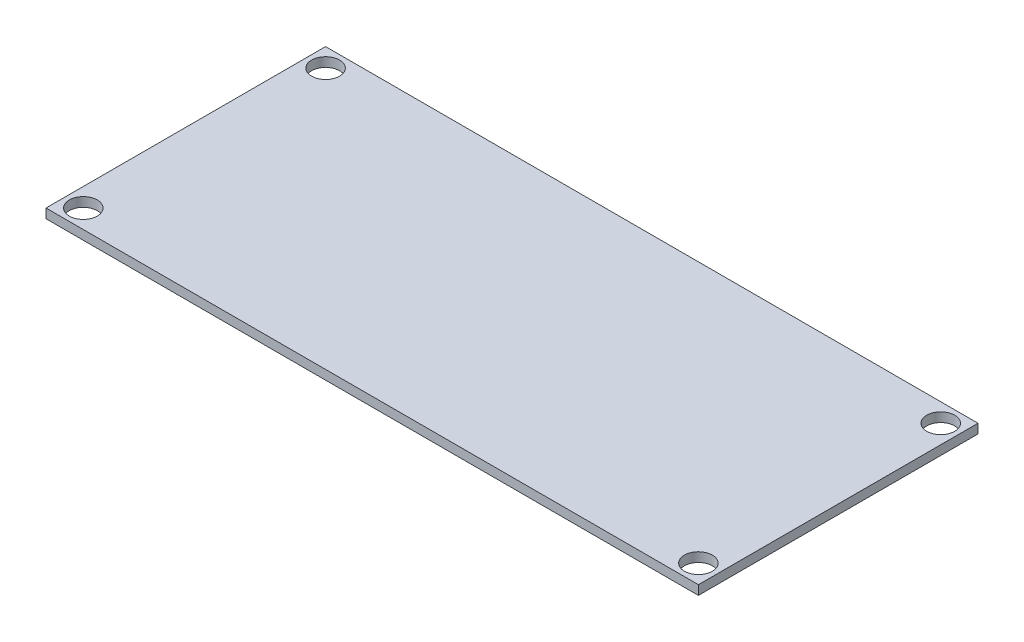
ISO-10303-21;
HEADER;
FILE_DESCRIPTION(('STEP AP214'),'2;1');
FILE_NAME('part.step','',(''),(''),'','','');
FILE_SCHEMA(('AUTOMOTIVE_DESIGN { 1 0 10303 214 1 1 1 1 }'));
ENDSEC;
DATA;
#1=APPLICATION_CONTEXT('core data for automotive mechanical design processes');
#2=APPLICATION_PROTOCOL_DEFINITION('international standard','automotive_design',2000,#1);
#3=PRODUCT_CONTEXT('',#1,'mechanical');
#4=PRODUCT('Part','Part','',(#3));
#5=PRODUCT_RELATED_PRODUCT_CATEGORY('part','',(#4));
#6=PRODUCT_DEFINITION_FORMATION('','',#4);
#7=PRODUCT_DEFINITION_CONTEXT('part definition',#1,'design');
#8=PRODUCT_DEFINITION('design','',#6,#7);
#9=PRODUCT_DEFINITION_SHAPE('','',#8);
#10=(LENGTH_UNIT() NAMED_UNIT(*) SI_UNIT(.MILLI.,.METRE.));
#11=(NAMED_UNIT(*) PLANE_ANGLE_UNIT() SI_UNIT($,.RADIAN.));
#12=(NAMED_UNIT(*) SI_UNIT($,.STERADIAN.) SOLID_ANGLE_UNIT());
#13=UNCERTAINTY_MEASURE_WITH_UNIT(LENGTH_MEASURE(1.E-05),#10,'distance_accuracy_value','');
#14=(GEOMETRIC_REPRESENTATION_CONTEXT(3) GLOBAL_UNCERTAINTY_ASSIGNED_CONTEXT((#13)) GLOBAL_UNIT_ASSIGNED_CONTEXT((#10,
#11,#12)) REPRESENTATION_CONTEXT('',''));
#15=CARTESIAN_POINT('',(0.,0.,0.));
#16=DIRECTION('',(0.,0.,1.));
#17=DIRECTION('',(1.,0.,0.));
#18=AXIS2_PLACEMENT_3D('',#15,#16,#17);
#19=CARTESIAN_POINT('',(0.,1.,0.));
#20=DIRECTION('',(0.,-1.,0.));
#21=DIRECTION('',(0.,0.,-1.));
#22=AXIS2_PLACEMENT_3D('',#19,#20,#21);
#23=PLANE('',#22);
#24=CARTESIAN_POINT('',(33.,1.,13.));
#25=DIRECTION('',(0.,1.,0.));
#26=DIRECTION('',(0.,0.,1.));
#27=AXIS2_PLACEMENT_3D('',#24,#25,#26);
#28=CIRCLE('',#27,1.5);
#29=CARTESIAN_POINT('',(33.,1.,14.5));
#30=VERTEX_POINT('',#29);
#31=EDGE_CURVE('E120',#30,#30,#28,.T.);
#32=ORIENTED_EDGE('',*,*,#31,.F.);
#33=EDGE_LOOP('',(#32));
#34=FACE_BOUND('',#33,.T.);
#35=CARTESIAN_POINT('',(-33.,1.,-13.));
#36=DIRECTION('',(0.,1.,0.));
#37=DIRECTION('',(0.,0.,1.));
#38=AXIS2_PLACEMENT_3D('',#35,#36,#37);
#39=CIRCLE('',#38,1.5);
#40=CARTESIAN_POINT('',(-33.,1.,-11.5));
#41=VERTEX_POINT('',#40);
#42=EDGE_CURVE('E99',#41,#41,#39,.T.);
#43=ORIENTED_EDGE('',*,*,#42,.F.);
#44=EDGE_LOOP('',(#43));
#45=FACE_BOUND('',#44,.T.);
#46=DIRECTION('',(0.,0.,-1.));
#47=VECTOR('',#46,1.);
#48=CARTESIAN_POINT('',(35.,1.,15.));
#49=LINE('',#48,#47);
#50=CARTESIAN_POINT('',(35.,1.,15.));
#51=VERTEX_POINT('',#50);
#52=CARTESIAN_POINT('',(35.,1.,-15.));
#53=VERTEX_POINT('',#52);
#54=EDGE_CURVE('E84',#51,#53,#49,.T.);
#55=ORIENTED_EDGE('',*,*,#54,.T.);
#56=DIRECTION('',(-1.,0.,0.));
#57=VECTOR('',#56,1.);
#58=CARTESIAN_POINT('',(-35.,1.,-15.));
#59=LINE('',#58,#57);
#60=CARTESIAN_POINT('',(-35.,1.,-15.));
#61=VERTEX_POINT('',#60);
#62=EDGE_CURVE('E79',#53,#61,#59,.T.);
#63=ORIENTED_EDGE('',*,*,#62,.T.);
#64=DIRECTION('',(0.,0.,1.));
#65=VECTOR('',#64,1.);
#66=CARTESIAN_POINT('',(-35.,1.,15.));
#67=LINE('',#66,#65);
#68=CARTESIAN_POINT('',(-35.,1.,15.));
#69=VERTEX_POINT('',#68);
#70=EDGE_CURVE('E82',#61,#69,#67,.T.);
#71=ORIENTED_EDGE('',*,*,#70,.T.);
#72=DIRECTION('',(1.,0.,0.));
#73=VECTOR('',#72,1.);
#74=CARTESIAN_POINT('',(-35.,1.,15.));
#75=LINE('',#74,#73);
#76=EDGE_CURVE('E49',#69,#51,#75,.T.);
#77=ORIENTED_EDGE('',*,*,#76,.T.);
#78=EDGE_LOOP('',(#55,#63,#71,#77));
#79=FACE_BOUND('',#78,.T.);
#80=CARTESIAN_POINT('',(33.,1.,-13.));
#81=DIRECTION('',(0.,1.,0.));
#82=DIRECTION('',(0.,0.,1.));
#83=AXIS2_PLACEMENT_3D('',#80,#81,#82);
#84=CIRCLE('',#83,1.5);
#85=CARTESIAN_POINT('',(33.,1.,-11.5));
#86=VERTEX_POINT('',#85);
#87=EDGE_CURVE('E114',#86,#86,#84,.T.);
#88=ORIENTED_EDGE('',*,*,#87,.F.);
#89=EDGE_LOOP('',(#88));
#90=FACE_BOUND('',#89,.T.);
#91=CARTESIAN_POINT('',(-33.,1.,13.));
#92=DIRECTION('',(0.,1.,0.));
#93=DIRECTION('',(0.,0.,1.));
#94=AXIS2_PLACEMENT_3D('',#91,#92,#93);
#95=CIRCLE('',#94,1.5);
#96=CARTESIAN_POINT('',(-33.,1.,14.5));
#97=VERTEX_POINT('',#96);
#98=EDGE_CURVE('E126',#97,#97,#95,.T.);
#99=ORIENTED_EDGE('',*,*,#98,.F.);
#100=EDGE_LOOP('',(#99));
#101=FACE_BOUND('',#100,.T.);
#102=ADVANCED_FACE('F32',(#34,#45,#79,#90,#101),#23,.F.);
#103=CARTESIAN_POINT('',(0.,0.,0.));
#104=DIRECTION('',(0.,-1.,0.));
#105=DIRECTION('',(0.,0.,-1.));
#106=AXIS2_PLACEMENT_3D('',#103,#104,#105);
#107=PLANE('',#106);
#108=CARTESIAN_POINT('',(33.,0.,13.));
#109=DIRECTION('',(0.,1.,0.));
#110=DIRECTION('',(0.,0.,1.));
#111=AXIS2_PLACEMENT_3D('',#108,#109,#110);
#112=CIRCLE('',#111,1.5);
#113=CARTESIAN_POINT('',(33.,0.,14.5));
#114=VERTEX_POINT('',#113);
#115=EDGE_CURVE('E123',#114,#114,#112,.T.);
#116=ORIENTED_EDGE('',*,*,#115,.T.);
#117=EDGE_LOOP('',(#116));
#118=FACE_BOUND('',#117,.T.);
#119=CARTESIAN_POINT('',(-33.,0.,-13.));
#120=DIRECTION('',(0.,1.,0.));
#121=DIRECTION('',(0.,0.,1.));
#122=AXIS2_PLACEMENT_3D('',#119,#120,#121);
#123=CIRCLE('',#122,1.5);
#124=CARTESIAN_POINT('',(-33.,0.,-11.5));
#125=VERTEX_POINT('',#124);
#126=EDGE_CURVE('E111',#125,#125,#123,.T.);
#127=ORIENTED_EDGE('',*,*,#126,.T.);
#128=EDGE_LOOP('',(#127));
#129=FACE_BOUND('',#128,.T.);
#130=DIRECTION('',(0.,0.,-1.));
#131=VECTOR('',#130,1.);
#132=CARTESIAN_POINT('',(35.,0.,15.));
#133=LINE('',#132,#131);
#134=CARTESIAN_POINT('',(35.,0.,15.));
#135=VERTEX_POINT('',#134);
#136=CARTESIAN_POINT('',(35.,0.,-15.));
#137=VERTEX_POINT('',#136);
#138=EDGE_CURVE('E96',#135,#137,#133,.T.);
#139=ORIENTED_EDGE('',*,*,#138,.F.);
#140=DIRECTION('',(1.,0.,0.));
#141=VECTOR('',#140,1.);
#142=CARTESIAN_POINT('',(-35.,0.,15.));
#143=LINE('',#142,#141);
#144=CARTESIAN_POINT('',(-35.,0.,15.));
#145=VERTEX_POINT('',#144);
#146=EDGE_CURVE('E72',#145,#135,#143,.T.);
#147=ORIENTED_EDGE('',*,*,#146,.F.);
#148=DIRECTION('',(0.,0.,1.));
#149=VECTOR('',#148,1.);
#150=CARTESIAN_POINT('',(-35.,0.,15.));
#151=LINE('',#150,#149);
#152=CARTESIAN_POINT('',(-35.,0.,-15.));
#153=VERTEX_POINT('',#152);
#154=EDGE_CURVE('E66',#153,#145,#151,.T.);
#155=ORIENTED_EDGE('',*,*,#154,.F.);
#156=DIRECTION('',(-1.,0.,0.));
#157=VECTOR('',#156,1.);
#158=CARTESIAN_POINT('',(-35.,0.,-15.));
#159=LINE('',#158,#157);
#160=EDGE_CURVE('E88',#137,#153,#159,.T.);
#161=ORIENTED_EDGE('',*,*,#160,.F.);
#162=EDGE_LOOP('',(#139,#147,#155,#161));
#163=FACE_BOUND('',#162,.T.);
#164=CARTESIAN_POINT('',(33.,0.,-13.));
#165=DIRECTION('',(0.,1.,0.));
#166=DIRECTION('',(0.,0.,1.));
#167=AXIS2_PLACEMENT_3D('',#164,#165,#166);
#168=CIRCLE('',#167,1.5);
#169=CARTESIAN_POINT('',(33.,0.,-11.5));
#170=VERTEX_POINT('',#169);
#171=EDGE_CURVE('E117',#170,#170,#168,.T.);
#172=ORIENTED_EDGE('',*,*,#171,.T.);
#173=EDGE_LOOP('',(#172));
#174=FACE_BOUND('',#173,.T.);
#175=CARTESIAN_POINT('',(-33.,0.,13.));
#176=DIRECTION('',(0.,1.,0.));
#177=DIRECTION('',(0.,0.,1.));
#178=AXIS2_PLACEMENT_3D('',#175,#176,#177);
#179=CIRCLE('',#178,1.5);
#180=CARTESIAN_POINT('',(-33.,0.,14.5));
#181=VERTEX_POINT('',#180);
#182=EDGE_CURVE('E129',#181,#181,#179,.T.);
#183=ORIENTED_EDGE('',*,*,#182,.T.);
#184=EDGE_LOOP('',(#183));
#185=FACE_BOUND('',#184,.T.);
#186=ADVANCED_FACE('F107',(#118,#129,#163,#174,#185),#107,.T.);
#187=CARTESIAN_POINT('',(35.,1.,15.));
#188=DIRECTION('',(-1.,0.,0.));
#189=DIRECTION('',(0.,0.,1.));
#190=AXIS2_PLACEMENT_3D('',#187,#188,#189);
#191=PLANE('',#190);
#192=ORIENTED_EDGE('',*,*,#138,.T.);
#193=DIRECTION('',(0.,-1.,0.));
#194=VECTOR('',#193,1.);
#195=CARTESIAN_POINT('',(35.,1.,-15.));
#196=LINE('',#195,#194);
#197=EDGE_CURVE('E11',#53,#137,#196,.T.);
#198=ORIENTED_EDGE('',*,*,#197,.F.);
#199=ORIENTED_EDGE('',*,*,#54,.F.);
#200=DIRECTION('',(0.,-1.,0.));
#201=VECTOR('',#200,1.);
#202=CARTESIAN_POINT('',(35.,1.,15.));
#203=LINE('',#202,#201);
#204=EDGE_CURVE('E92',#51,#135,#203,.T.);
#205=ORIENTED_EDGE('',*,*,#204,.T.);
#206=EDGE_LOOP('',(#192,#198,#199,#205));
#207=FACE_BOUND('',#206,.T.);
#208=ADVANCED_FACE('F34',(#207),#191,.F.);
#209=CARTESIAN_POINT('',(-35.,1.,-15.));
#210=DIRECTION('',(0.,0.,1.));
#211=DIRECTION('',(1.,0.,0.));
#212=AXIS2_PLACEMENT_3D('',#209,#210,#211);
#213=PLANE('',#212);
#214=ORIENTED_EDGE('',*,*,#160,.T.);
#215=DIRECTION('',(0.,-1.,0.));
#216=VECTOR('',#215,1.);
#217=CARTESIAN_POINT('',(-35.,1.,-15.));
#218=LINE('',#217,#216);
#219=EDGE_CURVE('E41',#61,#153,#218,.T.);
#220=ORIENTED_EDGE('',*,*,#219,.F.);
#221=ORIENTED_EDGE('',*,*,#62,.F.);
#222=ORIENTED_EDGE('',*,*,#197,.T.);
#223=EDGE_LOOP('',(#214,#220,#221,#222));
#224=FACE_BOUND('',#223,.T.);
#225=ADVANCED_FACE('F87',(#224),#213,.F.);
#226=CARTESIAN_POINT('',(-35.,1.,15.));
#227=DIRECTION('',(1.,0.,0.));
#228=DIRECTION('',(0.,0.,-1.));
#229=AXIS2_PLACEMENT_3D('',#226,#227,#228);
#230=PLANE('',#229);
#231=ORIENTED_EDGE('',*,*,#154,.T.);
#232=DIRECTION('',(0.,-1.,0.));
#233=VECTOR('',#232,1.);
#234=CARTESIAN_POINT('',(-35.,1.,15.));
#235=LINE('',#234,#233);
#236=EDGE_CURVE('E89',#69,#145,#235,.T.);
#237=ORIENTED_EDGE('',*,*,#236,.F.);
#238=ORIENTED_EDGE('',*,*,#70,.F.);
#239=ORIENTED_EDGE('',*,*,#219,.T.);
#240=EDGE_LOOP('',(#231,#237,#238,#239));
#241=FACE_BOUND('',#240,.T.);
#242=ADVANCED_FACE('F90',(#241),#230,.F.);
#243=CARTESIAN_POINT('',(-35.,1.,15.));
#244=DIRECTION('',(0.,0.,-1.));
#245=DIRECTION('',(-1.,0.,0.));
#246=AXIS2_PLACEMENT_3D('',#243,#244,#245);
#247=PLANE('',#246);
#248=ORIENTED_EDGE('',*,*,#146,.T.);
#249=ORIENTED_EDGE('',*,*,#204,.F.);
#250=ORIENTED_EDGE('',*,*,#76,.F.);
#251=ORIENTED_EDGE('',*,*,#236,.T.);
#252=EDGE_LOOP('',(#248,#249,#250,#251));
#253=FACE_BOUND('',#252,.T.);
#254=ADVANCED_FACE('F104',(#253),#247,.F.);
#255=CARTESIAN_POINT('',(-33.,1.,-13.));
#256=DIRECTION('',(0.,-1.,0.));
#257=DIRECTION('',(0.,0.,-1.));
#258=AXIS2_PLACEMENT_3D('',#255,#256,#257);
#259=CYLINDRICAL_SURFACE('',#258,1.5);
#260=ORIENTED_EDGE('',*,*,#42,.T.);
#261=EDGE_LOOP('',(#260));
#262=FACE_BOUND('',#261,.T.);
#263=ORIENTED_EDGE('',*,*,#126,.F.);
#264=EDGE_LOOP('',(#263));
#265=FACE_BOUND('',#264,.T.);
#266=ADVANCED_FACE('F149',(#262,#265),#259,.F.);
#267=CARTESIAN_POINT('',(33.,1.,-13.));
#268=DIRECTION('',(0.,-1.,0.));
#269=DIRECTION('',(0.,0.,-1.));
#270=AXIS2_PLACEMENT_3D('',#267,#268,#269);
#271=CYLINDRICAL_SURFACE('',#270,1.5);
#272=ORIENTED_EDGE('',*,*,#87,.T.);
#273=EDGE_LOOP('',(#272));
#274=FACE_BOUND('',#273,.T.);
#275=ORIENTED_EDGE('',*,*,#171,.F.);
#276=EDGE_LOOP('',(#275));
#277=FACE_BOUND('',#276,.T.);
#278=ADVANCED_FACE('F195',(#274,#277),#271,.F.);
#279=CARTESIAN_POINT('',(33.,1.,13.));
#280=DIRECTION('',(0.,-1.,0.));
#281=DIRECTION('',(0.,0.,-1.));
#282=AXIS2_PLACEMENT_3D('',#279,#280,#281);
#283=CYLINDRICAL_SURFACE('',#282,1.5);
#284=ORIENTED_EDGE('',*,*,#31,.T.);
#285=EDGE_LOOP('',(#284));
#286=FACE_BOUND('',#285,.T.);
#287=ORIENTED_EDGE('',*,*,#115,.F.);
#288=EDGE_LOOP('',(#287));
#289=FACE_BOUND('',#288,.T.);
#290=ADVANCED_FACE('F203',(#286,#289),#283,.F.);
#291=CARTESIAN_POINT('',(-33.,1.,13.));
#292=DIRECTION('',(0.,-1.,0.));
#293=DIRECTION('',(0.,0.,-1.));
#294=AXIS2_PLACEMENT_3D('',#291,#292,#293);
#295=CYLINDRICAL_SURFACE('',#294,1.5);
#296=ORIENTED_EDGE('',*,*,#98,.T.);
#297=EDGE_LOOP('',(#296));
#298=FACE_BOUND('',#297,.T.);
#299=ORIENTED_EDGE('',*,*,#182,.F.);
#300=EDGE_LOOP('',(#299));
#301=FACE_BOUND('',#300,.T.);
#302=ADVANCED_FACE('F135',(#298,#301),#295,.F.);
#303=CLOSED_SHELL('',(#102,#186,#208,#225,#242,#254,#266,#278,#290,#302));
#304=MANIFOLD_SOLID_BREP('B2',#303);
#305=ADVANCED_BREP_SHAPE_REPRESENTATION('',(#18,#304),#14);
#306=SHAPE_DEFINITION_REPRESENTATION(#9,#305);
ENDSEC;
END-ISO-10303-21;
